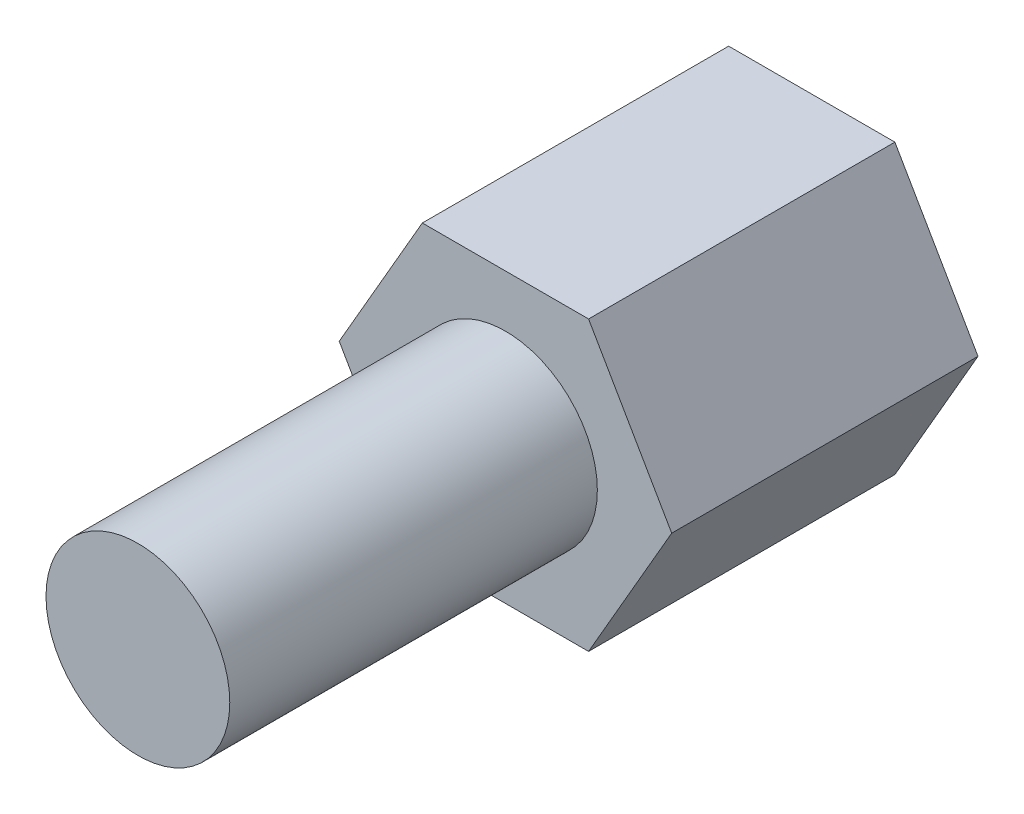
ISO-10303-21;
HEADER;
FILE_DESCRIPTION(('STEP AP214'),'2;1');
FILE_NAME('part.step','',(''),(''),'','','');
FILE_SCHEMA(('AUTOMOTIVE_DESIGN { 1 0 10303 214 1 1 1 1 }'));
ENDSEC;
DATA;
#1=APPLICATION_CONTEXT('core data for automotive mechanical design processes');
#2=APPLICATION_PROTOCOL_DEFINITION('international standard','automotive_design',2000,#1);
#3=PRODUCT_CONTEXT('',#1,'mechanical');
#4=PRODUCT('Part','Part','',(#3));
#5=PRODUCT_RELATED_PRODUCT_CATEGORY('part','',(#4));
#6=PRODUCT_DEFINITION_FORMATION('','',#4);
#7=PRODUCT_DEFINITION_CONTEXT('part definition',#1,'design');
#8=PRODUCT_DEFINITION('design','',#6,#7);
#9=PRODUCT_DEFINITION_SHAPE('','',#8);
#10=(LENGTH_UNIT() NAMED_UNIT(*) SI_UNIT(.MILLI.,.METRE.));
#11=(NAMED_UNIT(*) PLANE_ANGLE_UNIT() SI_UNIT($,.RADIAN.));
#12=(NAMED_UNIT(*) SI_UNIT($,.STERADIAN.) SOLID_ANGLE_UNIT());
#13=UNCERTAINTY_MEASURE_WITH_UNIT(LENGTH_MEASURE(1.E-05),#10,'distance_accuracy_value','');
#14=(GEOMETRIC_REPRESENTATION_CONTEXT(3) GLOBAL_UNCERTAINTY_ASSIGNED_CONTEXT((#13)) GLOBAL_UNIT_ASSIGNED_CONTEXT((#10,
#11,#12)) REPRESENTATION_CONTEXT('',''));
#15=CARTESIAN_POINT('',(0.,0.,0.));
#16=DIRECTION('',(0.,0.,1.));
#17=DIRECTION('',(1.,0.,0.));
#18=AXIS2_PLACEMENT_3D('',#15,#16,#17);
#19=CARTESIAN_POINT('',(1.35677313259565,-2.34999999999999,5.));
#20=DIRECTION('',(-0.866025403784442,0.499999999999995,0.));
#21=DIRECTION('',(-0.499999999999995,-0.866025403784442,0.));
#22=AXIS2_PLACEMENT_3D('',#19,#20,#21);
#23=PLANE('',#22);
#24=DIRECTION('',(0.499999999999995,0.866025403784442,0.));
#25=VECTOR('',#24,1.);
#26=CARTESIAN_POINT('',(1.35677313259565,-2.34999999999999,0.));
#27=LINE('',#26,#25);
#28=CARTESIAN_POINT('',(1.35677313259565,-2.34999999999999,0.));
#29=VERTEX_POINT('',#28);
#30=CARTESIAN_POINT('',(2.71354626519124,0.,0.));
#31=VERTEX_POINT('',#30);
#32=EDGE_CURVE('E138',#29,#31,#27,.T.);
#33=ORIENTED_EDGE('',*,*,#32,.T.);
#34=DIRECTION('',(0.,0.,-1.));
#35=VECTOR('',#34,1.);
#36=CARTESIAN_POINT('',(2.71354626519124,0.,5.));
#37=LINE('',#36,#35);
#38=CARTESIAN_POINT('',(2.71354626519124,0.,5.));
#39=VERTEX_POINT('',#38);
#40=EDGE_CURVE('E118',#39,#31,#37,.T.);
#41=ORIENTED_EDGE('',*,*,#40,.F.);
#42=DIRECTION('',(0.499999999999995,0.866025403784442,0.));
#43=VECTOR('',#42,1.);
#44=CARTESIAN_POINT('',(1.35677313259565,-2.34999999999999,5.));
#45=LINE('',#44,#43);
#46=CARTESIAN_POINT('',(1.35677313259565,-2.34999999999999,5.));
#47=VERTEX_POINT('',#46);
#48=EDGE_CURVE('E153',#47,#39,#45,.T.);
#49=ORIENTED_EDGE('',*,*,#48,.F.);
#50=DIRECTION('',(0.,0.,-1.));
#51=VECTOR('',#50,1.);
#52=CARTESIAN_POINT('',(1.35677313259565,-2.34999999999999,5.));
#53=LINE('',#52,#51);
#54=EDGE_CURVE('E121',#47,#29,#53,.T.);
#55=ORIENTED_EDGE('',*,*,#54,.T.);
#56=EDGE_LOOP('',(#33,#41,#49,#55));
#57=FACE_BOUND('',#56,.T.);
#58=ADVANCED_FACE('F49',(#57),#23,.F.);
#59=CARTESIAN_POINT('',(2.71354626519124,0.,5.));
#60=DIRECTION('',(-0.866025403784438,-0.500000000000001,0.));
#61=DIRECTION('',(0.500000000000001,-0.866025403784438,0.));
#62=AXIS2_PLACEMENT_3D('',#59,#60,#61);
#63=PLANE('',#62);
#64=DIRECTION('',(-0.500000000000001,0.866025403784438,0.));
#65=VECTOR('',#64,1.);
#66=CARTESIAN_POINT('',(2.71354626519124,0.,0.));
#67=LINE('',#66,#65);
#68=CARTESIAN_POINT('',(1.35677313259562,2.35000000000001,0.));
#69=VERTEX_POINT('',#68);
#70=EDGE_CURVE('E68',#31,#69,#67,.T.);
#71=ORIENTED_EDGE('',*,*,#70,.T.);
#72=DIRECTION('',(0.,0.,-1.));
#73=VECTOR('',#72,1.);
#74=CARTESIAN_POINT('',(1.35677313259562,2.35000000000001,5.));
#75=LINE('',#74,#73);
#76=CARTESIAN_POINT('',(1.35677313259562,2.35000000000001,5.));
#77=VERTEX_POINT('',#76);
#78=EDGE_CURVE('E115',#77,#69,#75,.T.);
#79=ORIENTED_EDGE('',*,*,#78,.F.);
#80=DIRECTION('',(-0.500000000000001,0.866025403784438,0.));
#81=VECTOR('',#80,1.);
#82=CARTESIAN_POINT('',(2.71354626519124,0.,5.));
#83=LINE('',#82,#81);
#84=EDGE_CURVE('E90',#39,#77,#83,.T.);
#85=ORIENTED_EDGE('',*,*,#84,.F.);
#86=ORIENTED_EDGE('',*,*,#40,.T.);
#87=EDGE_LOOP('',(#71,#79,#85,#86));
#88=FACE_BOUND('',#87,.T.);
#89=ADVANCED_FACE('F114',(#88),#63,.F.);
#90=CARTESIAN_POINT('',(1.35677313259562,2.35000000000001,5.));
#91=DIRECTION('',(0.,-1.,0.));
#92=DIRECTION('',(1.,0.,0.));
#93=AXIS2_PLACEMENT_3D('',#90,#91,#92);
#94=PLANE('',#93);
#95=DIRECTION('',(-1.,0.,0.));
#96=VECTOR('',#95,1.);
#97=CARTESIAN_POINT('',(1.35677313259562,2.35000000000001,0.));
#98=LINE('',#97,#96);
#99=CARTESIAN_POINT('',(-1.35677313259563,2.35,0.));
#100=VERTEX_POINT('',#99);
#101=EDGE_CURVE('E111',#69,#100,#98,.T.);
#102=ORIENTED_EDGE('',*,*,#101,.T.);
#103=DIRECTION('',(0.,0.,-1.));
#104=VECTOR('',#103,1.);
#105=CARTESIAN_POINT('',(-1.35677313259563,2.35,5.));
#106=LINE('',#105,#104);
#107=CARTESIAN_POINT('',(-1.35677313259563,2.35,5.));
#108=VERTEX_POINT('',#107);
#109=EDGE_CURVE('E174',#108,#100,#106,.T.);
#110=ORIENTED_EDGE('',*,*,#109,.F.);
#111=DIRECTION('',(-1.,0.,0.));
#112=VECTOR('',#111,1.);
#113=CARTESIAN_POINT('',(1.35677313259562,2.35000000000001,5.));
#114=LINE('',#113,#112);
#115=EDGE_CURVE('E124',#77,#108,#114,.T.);
#116=ORIENTED_EDGE('',*,*,#115,.F.);
#117=ORIENTED_EDGE('',*,*,#78,.T.);
#118=EDGE_LOOP('',(#102,#110,#116,#117));
#119=FACE_BOUND('',#118,.T.);
#120=ADVANCED_FACE('F123',(#119),#94,.F.);
#121=CARTESIAN_POINT('',(-1.35677313259563,2.35,5.));
#122=DIRECTION('',(0.866025403784442,-0.499999999999995,0.));
#123=DIRECTION('',(0.499999999999995,0.866025403784442,0.));
#124=AXIS2_PLACEMENT_3D('',#121,#122,#123);
#125=PLANE('',#124);
#126=DIRECTION('',(-0.499999999999995,-0.866025403784441,0.));
#127=VECTOR('',#126,1.);
#128=CARTESIAN_POINT('',(-1.35677313259563,2.35,0.));
#129=LINE('',#128,#127);
#130=CARTESIAN_POINT('',(-2.71354626519124,0.,0.));
#131=VERTEX_POINT('',#130);
#132=EDGE_CURVE('E126',#100,#131,#129,.T.);
#133=ORIENTED_EDGE('',*,*,#132,.T.);
#134=DIRECTION('',(0.,0.,-1.));
#135=VECTOR('',#134,1.);
#136=CARTESIAN_POINT('',(-2.71354626519124,0.,5.));
#137=LINE('',#136,#135);
#138=CARTESIAN_POINT('',(-2.71354626519124,0.,5.));
#139=VERTEX_POINT('',#138);
#140=EDGE_CURVE('E166',#139,#131,#137,.T.);
#141=ORIENTED_EDGE('',*,*,#140,.F.);
#142=DIRECTION('',(-0.499999999999995,-0.866025403784441,0.));
#143=VECTOR('',#142,1.);
#144=CARTESIAN_POINT('',(-1.35677313259563,2.35,5.));
#145=LINE('',#144,#143);
#146=EDGE_CURVE('E146',#108,#139,#145,.T.);
#147=ORIENTED_EDGE('',*,*,#146,.F.);
#148=ORIENTED_EDGE('',*,*,#109,.T.);
#149=EDGE_LOOP('',(#133,#141,#147,#148));
#150=FACE_BOUND('',#149,.T.);
#151=ADVANCED_FACE('F183',(#150),#125,.F.);
#152=CARTESIAN_POINT('',(-2.71354626519124,0.,5.));
#153=DIRECTION('',(0.866025403784434,0.500000000000007,0.));
#154=DIRECTION('',(-0.500000000000007,0.866025403784435,0.));
#155=AXIS2_PLACEMENT_3D('',#152,#153,#154);
#156=PLANE('',#155);
#157=DIRECTION('',(0.500000000000007,-0.866025403784434,0.));
#158=VECTOR('',#157,1.);
#159=CARTESIAN_POINT('',(-2.71354626519124,0.,0.));
#160=LINE('',#159,#158);
#161=CARTESIAN_POINT('',(-1.3567731325956,-2.35000000000001,0.));
#162=VERTEX_POINT('',#161);
#163=EDGE_CURVE('E172',#131,#162,#160,.T.);
#164=ORIENTED_EDGE('',*,*,#163,.T.);
#165=DIRECTION('',(0.,0.,-1.));
#166=VECTOR('',#165,1.);
#167=CARTESIAN_POINT('',(-1.3567731325956,-2.35000000000001,5.));
#168=LINE('',#167,#166);
#169=CARTESIAN_POINT('',(-1.3567731325956,-2.35000000000001,5.));
#170=VERTEX_POINT('',#169);
#171=EDGE_CURVE('E158',#170,#162,#168,.T.);
#172=ORIENTED_EDGE('',*,*,#171,.F.);
#173=DIRECTION('',(0.500000000000007,-0.866025403784434,0.));
#174=VECTOR('',#173,1.);
#175=CARTESIAN_POINT('',(-2.71354626519124,0.,5.));
#176=LINE('',#175,#174);
#177=EDGE_CURVE('E143',#139,#170,#176,.T.);
#178=ORIENTED_EDGE('',*,*,#177,.F.);
#179=ORIENTED_EDGE('',*,*,#140,.T.);
#180=EDGE_LOOP('',(#164,#172,#178,#179));
#181=FACE_BOUND('',#180,.T.);
#182=ADVANCED_FACE('F185',(#181),#156,.F.);
#183=CARTESIAN_POINT('',(-1.3567731325956,-2.35000000000001,5.));
#184=DIRECTION('',(0.,1.,0.));
#185=DIRECTION('',(-1.,0.,0.));
#186=AXIS2_PLACEMENT_3D('',#183,#184,#185);
#187=PLANE('',#186);
#188=DIRECTION('',(1.,0.,0.));
#189=VECTOR('',#188,1.);
#190=CARTESIAN_POINT('',(-1.3567731325956,-2.35000000000001,0.));
#191=LINE('',#190,#189);
#192=EDGE_CURVE('E99',#162,#29,#191,.T.);
#193=ORIENTED_EDGE('',*,*,#192,.T.);
#194=ORIENTED_EDGE('',*,*,#54,.F.);
#195=DIRECTION('',(1.,0.,0.));
#196=VECTOR('',#195,1.);
#197=CARTESIAN_POINT('',(-1.3567731325956,-2.35000000000001,5.));
#198=LINE('',#197,#196);
#199=EDGE_CURVE('E60',#170,#47,#198,.T.);
#200=ORIENTED_EDGE('',*,*,#199,.F.);
#201=ORIENTED_EDGE('',*,*,#171,.T.);
#202=EDGE_LOOP('',(#193,#194,#200,#201));
#203=FACE_BOUND('',#202,.T.);
#204=ADVANCED_FACE('F187',(#203),#187,.F.);
#205=CARTESIAN_POINT('',(0.,0.,5.));
#206=DIRECTION('',(0.,0.,1.));
#207=DIRECTION('',(1.,0.,0.));
#208=AXIS2_PLACEMENT_3D('',#205,#206,#207);
#209=PLANE('',#208);
#210=CARTESIAN_POINT('',(0.,0.,5.));
#211=DIRECTION('',(0.,0.,1.));
#212=DIRECTION('',(1.,0.,0.));
#213=AXIS2_PLACEMENT_3D('',#210,#211,#212);
#214=CIRCLE('',#213,1.5);
#215=CARTESIAN_POINT('',(1.5,0.,5.));
#216=VERTEX_POINT('',#215);
#217=EDGE_CURVE('E53',#216,#216,#214,.F.);
#218=ORIENTED_EDGE('',*,*,#217,.T.);
#219=EDGE_LOOP('',(#218));
#220=FACE_BOUND('',#219,.T.);
#221=ORIENTED_EDGE('',*,*,#48,.T.);
#222=ORIENTED_EDGE('',*,*,#84,.T.);
#223=ORIENTED_EDGE('',*,*,#115,.T.);
#224=ORIENTED_EDGE('',*,*,#146,.T.);
#225=ORIENTED_EDGE('',*,*,#177,.T.);
#226=ORIENTED_EDGE('',*,*,#199,.T.);
#227=EDGE_LOOP('',(#221,#222,#223,#224,#225,#226));
#228=FACE_BOUND('',#227,.T.);
#229=ADVANCED_FACE('F188',(#220,#228),#209,.T.);
#230=CARTESIAN_POINT('',(0.,0.,0.));
#231=DIRECTION('',(0.,0.,1.));
#232=DIRECTION('',(1.,0.,0.));
#233=AXIS2_PLACEMENT_3D('',#230,#231,#232);
#234=PLANE('',#233);
#235=CARTESIAN_POINT('',(0.,0.,0.));
#236=DIRECTION('',(0.,0.,-1.));
#237=DIRECTION('',(-1.,0.,0.));
#238=AXIS2_PLACEMENT_3D('',#235,#236,#237);
#239=CIRCLE('',#238,1.5);
#240=CARTESIAN_POINT('',(-1.5,0.,0.));
#241=VERTEX_POINT('',#240);
#242=EDGE_CURVE('E12',#241,#241,#239,.T.);
#243=ORIENTED_EDGE('',*,*,#242,.F.);
#244=EDGE_LOOP('',(#243));
#245=FACE_BOUND('',#244,.T.);
#246=ORIENTED_EDGE('',*,*,#32,.F.);
#247=ORIENTED_EDGE('',*,*,#192,.F.);
#248=ORIENTED_EDGE('',*,*,#163,.F.);
#249=ORIENTED_EDGE('',*,*,#132,.F.);
#250=ORIENTED_EDGE('',*,*,#101,.F.);
#251=ORIENTED_EDGE('',*,*,#70,.F.);
#252=EDGE_LOOP('',(#246,#247,#248,#249,#250,#251));
#253=FACE_BOUND('',#252,.T.);
#254=ADVANCED_FACE('F129',(#245,#253),#234,.F.);
#255=CARTESIAN_POINT('',(0.,0.,9.24264068711929));
#256=DIRECTION('',(0.,0.,-1.));
#257=DIRECTION('',(-1.,0.,0.));
#258=AXIS2_PLACEMENT_3D('',#255,#256,#257);
#259=CYLINDRICAL_SURFACE('',#258,1.5);
#260=ORIENTED_EDGE('',*,*,#242,.T.);
#261=EDGE_LOOP('',(#260));
#262=FACE_BOUND('',#261,.T.);
#263=ORIENTED_EDGE('',*,*,#217,.F.);
#264=EDGE_LOOP('',(#263));
#265=FACE_BOUND('',#264,.T.);
#266=ADVANCED_FACE('F51',(#262,#265),#259,.F.);
#267=CLOSED_SHELL('',(#58,#89,#120,#151,#182,#204,#229,#254,#266));
#268=MANIFOLD_SOLID_BREP('B2',#267);
#269=CARTESIAN_POINT('',(0.,0.,11.));
#270=DIRECTION('',(0.,0.,1.));
#271=DIRECTION('',(1.,0.,0.));
#272=AXIS2_PLACEMENT_3D('',#269,#270,#271);
#273=PLANE('',#272);
#274=CARTESIAN_POINT('',(0.,0.,11.));
#275=DIRECTION('',(0.,0.,1.));
#276=DIRECTION('',(1.,0.,0.));
#277=AXIS2_PLACEMENT_3D('',#274,#275,#276);
#278=CIRCLE('',#277,1.5);
#279=CARTESIAN_POINT('',(1.5,0.,11.));
#280=VERTEX_POINT('',#279);
#281=EDGE_CURVE('E48',#280,#280,#278,.T.);
#282=ORIENTED_EDGE('',*,*,#281,.T.);
#283=EDGE_LOOP('',(#282));
#284=FACE_BOUND('',#283,.T.);
#285=ADVANCED_FACE('F266',(#284),#273,.T.);
#286=CARTESIAN_POINT('',(0.,0.,11.));
#287=DIRECTION('',(0.,0.,-1.));
#288=DIRECTION('',(-1.,0.,0.));
#289=AXIS2_PLACEMENT_3D('',#286,#287,#288);
#290=CYLINDRICAL_SURFACE('',#289,1.5);
#291=ORIENTED_EDGE('',*,*,#281,.F.);
#292=EDGE_LOOP('',(#291));
#293=FACE_BOUND('',#292,.T.);
#294=CARTESIAN_POINT('',(0.,0.,5.));
#295=DIRECTION('',(0.,0.,1.));
#296=DIRECTION('',(1.,0.,0.));
#297=AXIS2_PLACEMENT_3D('',#294,#295,#296);
#298=CIRCLE('',#297,1.5);
#299=CARTESIAN_POINT('',(1.5,0.,5.));
#300=VERTEX_POINT('',#299);
#301=EDGE_CURVE('E273',#300,#300,#298,.F.);
#302=ORIENTED_EDGE('',*,*,#301,.F.);
#303=EDGE_LOOP('',(#302));
#304=FACE_BOUND('',#303,.T.);
#305=ADVANCED_FACE('F268',(#293,#304),#290,.T.);
#306=CARTESIAN_POINT('',(0.,0.,5.));
#307=DIRECTION('',(0.,0.,1.));
#308=DIRECTION('',(1.,0.,0.));
#309=AXIS2_PLACEMENT_3D('',#306,#307,#308);
#310=PLANE('',#309);
#311=ORIENTED_EDGE('',*,*,#301,.T.);
#312=EDGE_LOOP('',(#311));
#313=FACE_BOUND('',#312,.T.);
#314=ADVANCED_FACE('F279',(#313),#310,.F.);
#315=CLOSED_SHELL('',(#285,#305,#314));
#316=MANIFOLD_SOLID_BREP('B6',#315);
#317=ADVANCED_BREP_SHAPE_REPRESENTATION('',(#18,#268,#316),#14);
#318=SHAPE_DEFINITION_REPRESENTATION(#9,#317);
ENDSEC;
END-ISO-10303-21;
